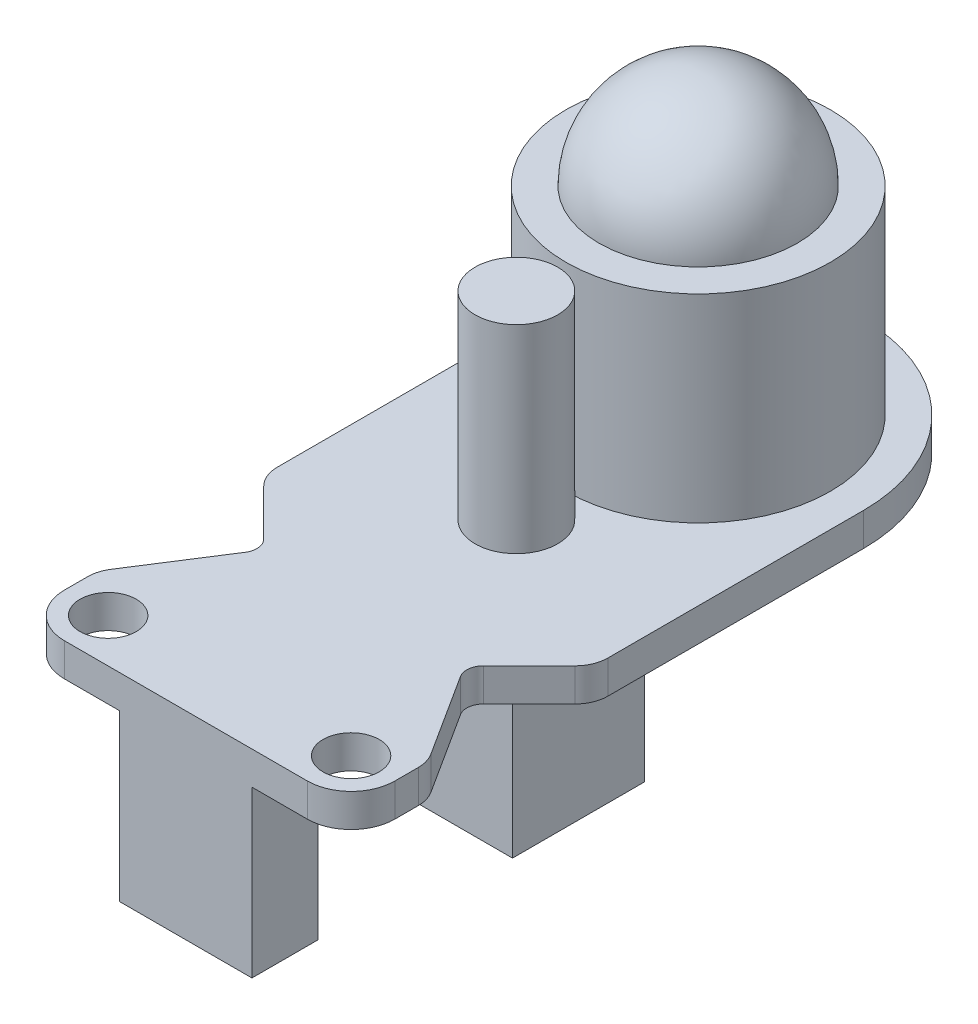
ISO-10303-21;
HEADER;
FILE_DESCRIPTION(('STEP AP214'),'2;1');
FILE_NAME('part.step','',(''),(''),'','','');
FILE_SCHEMA(('AUTOMOTIVE_DESIGN { 1 0 10303 214 1 1 1 1 }'));
ENDSEC;
DATA;
#1=APPLICATION_CONTEXT('core data for automotive mechanical design processes');
#2=APPLICATION_PROTOCOL_DEFINITION('international standard','automotive_design',2000,#1);
#3=PRODUCT_CONTEXT('',#1,'mechanical');
#4=PRODUCT('Part','Part','',(#3));
#5=PRODUCT_RELATED_PRODUCT_CATEGORY('part','',(#4));
#6=PRODUCT_DEFINITION_FORMATION('','',#4);
#7=PRODUCT_DEFINITION_CONTEXT('part definition',#1,'design');
#8=PRODUCT_DEFINITION('design','',#6,#7);
#9=PRODUCT_DEFINITION_SHAPE('','',#8);
#10=(LENGTH_UNIT() NAMED_UNIT(*) SI_UNIT(.MILLI.,.METRE.));
#11=(NAMED_UNIT(*) PLANE_ANGLE_UNIT() SI_UNIT($,.RADIAN.));
#12=(NAMED_UNIT(*) SI_UNIT($,.STERADIAN.) SOLID_ANGLE_UNIT());
#13=UNCERTAINTY_MEASURE_WITH_UNIT(LENGTH_MEASURE(1.E-05),#10,'distance_accuracy_value','');
#14=(GEOMETRIC_REPRESENTATION_CONTEXT(3) GLOBAL_UNCERTAINTY_ASSIGNED_CONTEXT((#13)) GLOBAL_UNIT_ASSIGNED_CONTEXT((#10,
#11,#12)) REPRESENTATION_CONTEXT('',''));
#15=CARTESIAN_POINT('',(0.,0.,0.));
#16=DIRECTION('',(0.,0.,1.));
#17=DIRECTION('',(1.,0.,0.));
#18=AXIS2_PLACEMENT_3D('',#15,#16,#17);
#19=CARTESIAN_POINT('',(-7.35,0.,0.));
#20=DIRECTION('',(0.,-1.,0.));
#21=DIRECTION('',(0.,0.,-1.));
#22=AXIS2_PLACEMENT_3D('',#19,#20,#21);
#23=PLANE('',#22);
#24=CARTESIAN_POINT('',(-7.35,0.,0.));
#25=DIRECTION('',(0.,1.,0.));
#26=DIRECTION('',(0.,0.,-1.));
#27=AXIS2_PLACEMENT_3D('',#24,#25,#26);
#28=CIRCLE('',#27,1.7);
#29=CARTESIAN_POINT('',(-7.35,0.,-1.7));
#30=VERTEX_POINT('',#29);
#31=EDGE_CURVE('E275',#30,#30,#28,.T.);
#32=ORIENTED_EDGE('',*,*,#31,.T.);
#33=EDGE_LOOP('',(#32));
#34=FACE_BOUND('',#33,.T.);
#35=CARTESIAN_POINT('',(7.35,0.,0.));
#36=DIRECTION('',(0.,1.,0.));
#37=DIRECTION('',(0.,0.,1.));
#38=AXIS2_PLACEMENT_3D('',#35,#36,#37);
#39=CIRCLE('',#38,1.7);
#40=CARTESIAN_POINT('',(7.35,0.,1.7));
#41=VERTEX_POINT('',#40);
#42=EDGE_CURVE('E271',#41,#41,#39,.T.);
#43=ORIENTED_EDGE('',*,*,#42,.T.);
#44=EDGE_LOOP('',(#43));
#45=FACE_BOUND('',#44,.T.);
#46=DIRECTION('',(1.,0.,0.));
#47=VECTOR('',#46,1.);
#48=CARTESIAN_POINT('',(3.60168525792392,0.,-21.5134690772025));
#49=LINE('',#48,#47);
#50=CARTESIAN_POINT('',(-4.39831474207608,0.,-21.5134690772025));
#51=VERTEX_POINT('',#50);
#52=CARTESIAN_POINT('',(3.60168525792392,0.,-21.5134690772025));
#53=VERTEX_POINT('',#52);
#54=EDGE_CURVE('E237',#51,#53,#49,.T.);
#55=ORIENTED_EDGE('',*,*,#54,.F.);
#56=DIRECTION('',(0.,0.,-1.));
#57=VECTOR('',#56,1.);
#58=CARTESIAN_POINT('',(-4.39831474207608,0.,-21.5134690772025));
#59=LINE('',#58,#57);
#60=CARTESIAN_POINT('',(-4.39831474207608,0.,-13.5134690772025));
#61=VERTEX_POINT('',#60);
#62=EDGE_CURVE('E234',#61,#51,#59,.T.);
#63=ORIENTED_EDGE('',*,*,#62,.F.);
#64=DIRECTION('',(-1.,0.,0.));
#65=VECTOR('',#64,1.);
#66=CARTESIAN_POINT('',(3.60168525792392,0.,-13.5134690772025));
#67=LINE('',#66,#65);
#68=CARTESIAN_POINT('',(3.60168525792392,0.,-13.5134690772025));
#69=VERTEX_POINT('',#68);
#70=EDGE_CURVE('E246',#69,#61,#67,.T.);
#71=ORIENTED_EDGE('',*,*,#70,.F.);
#72=DIRECTION('',(0.,0.,1.));
#73=VECTOR('',#72,1.);
#74=CARTESIAN_POINT('',(3.60168525792392,0.,-21.5134690772025));
#75=LINE('',#74,#73);
#76=EDGE_CURVE('E254',#53,#69,#75,.T.);
#77=ORIENTED_EDGE('',*,*,#76,.F.);
#78=EDGE_LOOP('',(#55,#63,#71,#77));
#79=FACE_BOUND('',#78,.T.);
#80=DIRECTION('',(1.,0.,0.));
#81=VECTOR('',#80,1.);
#82=CARTESIAN_POINT('',(4.,0.,-1.35));
#83=LINE('',#82,#81);
#84=CARTESIAN_POINT('',(-4.,0.,-1.35));
#85=VERTEX_POINT('',#84);
#86=CARTESIAN_POINT('',(4.,0.,-1.35));
#87=VERTEX_POINT('',#86);
#88=EDGE_CURVE('E452',#85,#87,#83,.T.);
#89=ORIENTED_EDGE('',*,*,#88,.F.);
#90=DIRECTION('',(0.,0.,-1.));
#91=VECTOR('',#90,1.);
#92=CARTESIAN_POINT('',(-4.,0.,-1.35));
#93=LINE('',#92,#91);
#94=CARTESIAN_POINT('',(-4.,0.,2.65));
#95=VERTEX_POINT('',#94);
#96=EDGE_CURVE('E232',#95,#85,#93,.T.);
#97=ORIENTED_EDGE('',*,*,#96,.F.);
#98=DIRECTION('',(1.,0.,0.));
#99=VECTOR('',#98,1.);
#100=CARTESIAN_POINT('',(7.35,0.,2.65));
#101=LINE('',#100,#99);
#102=CARTESIAN_POINT('',(-7.35,0.,2.65));
#103=VERTEX_POINT('',#102);
#104=EDGE_CURVE('E322',#103,#95,#101,.T.);
#105=ORIENTED_EDGE('',*,*,#104,.F.);
#106=CARTESIAN_POINT('',(-7.35,0.,0.));
#107=DIRECTION('',(0.,1.,0.));
#108=DIRECTION('',(0.,0.,-1.));
#109=AXIS2_PLACEMENT_3D('',#106,#107,#108);
#110=CIRCLE('',#109,2.65);
#111=CARTESIAN_POINT('',(-10.,0.,0.));
#112=VERTEX_POINT('',#111);
#113=EDGE_CURVE('E281',#112,#103,#110,.T.);
#114=ORIENTED_EDGE('',*,*,#113,.F.);
#115=DIRECTION('',(0.,0.,1.));
#116=VECTOR('',#115,1.);
#117=CARTESIAN_POINT('',(-10.,0.,-2.));
#118=LINE('',#117,#116);
#119=CARTESIAN_POINT('',(-10.,0.,-1.41518014706803));
#120=VERTEX_POINT('',#119);
#121=EDGE_CURVE('E288',#120,#112,#118,.T.);
#122=ORIENTED_EDGE('',*,*,#121,.F.);
#123=CARTESIAN_POINT('',(-8.,0.,-1.41518014706802));
#124=DIRECTION('',(0.,-1.,0.));
#125=DIRECTION('',(0.,0.,-1.));
#126=AXIS2_PLACEMENT_3D('',#123,#124,#125);
#127=CIRCLE('',#126,2.);
#128=CARTESIAN_POINT('',(-9.68492571431289,0.,-2.49268900422288));
#129=VERTEX_POINT('',#128);
#130=EDGE_CURVE('E390',#120,#129,#127,.T.);
#131=ORIENTED_EDGE('',*,*,#130,.T.);
#132=DIRECTION('',(-0.538754428577431,0.,0.842462857156448));
#133=VECTOR('',#132,1.);
#134=CARTESIAN_POINT('',(-6.50753714284355,0.,-7.46124557142257));
#135=LINE('',#134,#133);
#136=CARTESIAN_POINT('',(-6.50753714284355,0.,-7.46124557142257));
#137=VERTEX_POINT('',#136);
#138=EDGE_CURVE('E348',#137,#129,#135,.T.);
#139=ORIENTED_EDGE('',*,*,#138,.F.);
#140=CARTESIAN_POINT('',(-7.35,0.,-8.));
#141=DIRECTION('',(0.,-1.,0.));
#142=DIRECTION('',(0.,0.,-1.));
#143=AXIS2_PLACEMENT_3D('',#140,#141,#142);
#144=CIRCLE('',#143,1.);
#145=CARTESIAN_POINT('',(-6.64289321881345,0.,-8.70710678118655));
#146=VERTEX_POINT('',#145);
#147=EDGE_CURVE('E346',#146,#137,#144,.T.);
#148=ORIENTED_EDGE('',*,*,#147,.F.);
#149=DIRECTION('',(0.707106781186549,0.,0.707106781186546));
#150=VECTOR('',#149,1.);
#151=CARTESIAN_POINT('',(-9.99999999999999,0.,-12.0642135623731));
#152=LINE('',#151,#150);
#153=CARTESIAN_POINT('',(-9.41421356237309,0.,-11.4784271247462));
#154=VERTEX_POINT('',#153);
#155=EDGE_CURVE('E344',#154,#146,#152,.T.);
#156=ORIENTED_EDGE('',*,*,#155,.F.);
#157=CARTESIAN_POINT('',(-7.99999999999999,0.,-12.8926406871193));
#158=DIRECTION('',(0.,-1.,0.));
#159=DIRECTION('',(0.,0.,-1.));
#160=AXIS2_PLACEMENT_3D('',#157,#158,#159);
#161=CIRCLE('',#160,2.);
#162=CARTESIAN_POINT('',(-9.99999999999999,0.,-12.8926406871193));
#163=VERTEX_POINT('',#162);
#164=EDGE_CURVE('E388',#154,#163,#161,.T.);
#165=ORIENTED_EDGE('',*,*,#164,.T.);
#166=DIRECTION('',(0.,0.,1.));
#167=VECTOR('',#166,1.);
#168=CARTESIAN_POINT('',(-10.,0.,-28.35));
#169=LINE('',#168,#167);
#170=CARTESIAN_POINT('',(-10.,0.,-28.35));
#171=VERTEX_POINT('',#170);
#172=EDGE_CURVE('E341',#171,#163,#169,.T.);
#173=ORIENTED_EDGE('',*,*,#172,.F.);
#174=CARTESIAN_POINT('',(0.,0.,-28.35));
#175=DIRECTION('',(0.,1.,0.));
#176=DIRECTION('',(0.,0.,1.));
#177=AXIS2_PLACEMENT_3D('',#174,#175,#176);
#178=CIRCLE('',#177,10.);
#179=CARTESIAN_POINT('',(10.,0.,-28.35));
#180=VERTEX_POINT('',#179);
#181=EDGE_CURVE('E339',#180,#171,#178,.T.);
#182=ORIENTED_EDGE('',*,*,#181,.F.);
#183=DIRECTION('',(0.,0.,-1.));
#184=VECTOR('',#183,1.);
#185=CARTESIAN_POINT('',(10.,0.,-28.35));
#186=LINE('',#185,#184);
#187=CARTESIAN_POINT('',(9.99999999999999,0.,-12.8926406871193));
#188=VERTEX_POINT('',#187);
#189=EDGE_CURVE('E337',#188,#180,#186,.T.);
#190=ORIENTED_EDGE('',*,*,#189,.F.);
#191=CARTESIAN_POINT('',(7.99999999999999,0.,-12.8926406871193));
#192=DIRECTION('',(0.,-1.,0.));
#193=DIRECTION('',(0.,0.,-1.));
#194=AXIS2_PLACEMENT_3D('',#191,#192,#193);
#195=CIRCLE('',#194,2.);
#196=CARTESIAN_POINT('',(9.41421356237309,0.,-11.4784271247462));
#197=VERTEX_POINT('',#196);
#198=EDGE_CURVE('E384',#188,#197,#195,.T.);
#199=ORIENTED_EDGE('',*,*,#198,.T.);
#200=DIRECTION('',(0.707106781186548,0.,-0.707106781186547));
#201=VECTOR('',#200,1.);
#202=CARTESIAN_POINT('',(9.99999999999999,0.,-12.0642135623731));
#203=LINE('',#202,#201);
#204=CARTESIAN_POINT('',(6.64289321881345,0.,-8.70710678118655));
#205=VERTEX_POINT('',#204);
#206=EDGE_CURVE('E334',#205,#197,#203,.T.);
#207=ORIENTED_EDGE('',*,*,#206,.F.);
#208=CARTESIAN_POINT('',(7.35,0.,-8.));
#209=DIRECTION('',(0.,-1.,0.));
#210=DIRECTION('',(0.,0.,1.));
#211=AXIS2_PLACEMENT_3D('',#208,#209,#210);
#212=CIRCLE('',#211,0.999999999999999);
#213=CARTESIAN_POINT('',(6.50753714284355,0.,-7.46124557142257));
#214=VERTEX_POINT('',#213);
#215=EDGE_CURVE('E332',#214,#205,#212,.T.);
#216=ORIENTED_EDGE('',*,*,#215,.F.);
#217=DIRECTION('',(-0.538754428577431,0.,-0.842462857156448));
#218=VECTOR('',#217,1.);
#219=CARTESIAN_POINT('',(6.50753714284355,0.,-7.46124557142257));
#220=LINE('',#219,#218);
#221=CARTESIAN_POINT('',(9.6849257143129,0.,-2.49268900422288));
#222=VERTEX_POINT('',#221);
#223=EDGE_CURVE('E330',#222,#214,#220,.T.);
#224=ORIENTED_EDGE('',*,*,#223,.F.);
#225=CARTESIAN_POINT('',(8.,0.,-1.41518014706802));
#226=DIRECTION('',(0.,-1.,0.));
#227=DIRECTION('',(0.,0.,-1.));
#228=AXIS2_PLACEMENT_3D('',#225,#226,#227);
#229=CIRCLE('',#228,2.);
#230=CARTESIAN_POINT('',(10.,0.,-1.41518014706803));
#231=VERTEX_POINT('',#230);
#232=EDGE_CURVE('E386',#222,#231,#229,.T.);
#233=ORIENTED_EDGE('',*,*,#232,.T.);
#234=DIRECTION('',(0.,0.,-1.));
#235=VECTOR('',#234,1.);
#236=CARTESIAN_POINT('',(10.,0.,-2.));
#237=LINE('',#236,#235);
#238=CARTESIAN_POINT('',(10.,0.,0.));
#239=VERTEX_POINT('',#238);
#240=EDGE_CURVE('E327',#239,#231,#237,.T.);
#241=ORIENTED_EDGE('',*,*,#240,.F.);
#242=CARTESIAN_POINT('',(7.35,0.,0.));
#243=DIRECTION('',(0.,1.,0.));
#244=DIRECTION('',(0.,0.,1.));
#245=AXIS2_PLACEMENT_3D('',#242,#243,#244);
#246=CIRCLE('',#245,2.65);
#247=CARTESIAN_POINT('',(7.35,0.,2.65));
#248=VERTEX_POINT('',#247);
#249=EDGE_CURVE('E325',#248,#239,#246,.T.);
#250=ORIENTED_EDGE('',*,*,#249,.F.);
#251=CARTESIAN_POINT('',(4.,0.,2.65));
#252=VERTEX_POINT('',#251);
#253=EDGE_CURVE('E321',#252,#248,#101,.T.);
#254=ORIENTED_EDGE('',*,*,#253,.F.);
#255=DIRECTION('',(0.,0.,1.));
#256=VECTOR('',#255,1.);
#257=CARTESIAN_POINT('',(4.,0.,-1.35));
#258=LINE('',#257,#256);
#259=EDGE_CURVE('E228',#87,#252,#258,.T.);
#260=ORIENTED_EDGE('',*,*,#259,.F.);
#261=EDGE_LOOP('',(#89,#97,#105,#114,#122,#131,#139,#148,#156,#165,#173,#182,#190,#199,#207,
#216,#224,#233,#241,#250,#254,#260));
#262=FACE_BOUND('',#261,.T.);
#263=ADVANCED_FACE('F35',(#34,#45,#79,#262),#23,.T.);
#264=CARTESIAN_POINT('',(-7.35,2.,0.));
#265=DIRECTION('',(0.,-1.,0.));
#266=DIRECTION('',(0.,0.,-1.));
#267=AXIS2_PLACEMENT_3D('',#264,#265,#266);
#268=PLANE('',#267);
#269=CARTESIAN_POINT('',(0.,2.,-17.35));
#270=DIRECTION('',(0.,-1.,0.));
#271=DIRECTION('',(0.,0.,-1.));
#272=AXIS2_PLACEMENT_3D('',#269,#270,#271);
#273=CIRCLE('',#272,2.5);
#274=CARTESIAN_POINT('',(0.,2.,-19.85));
#275=VERTEX_POINT('',#274);
#276=EDGE_CURVE('E11',#275,#275,#273,.F.);
#277=ORIENTED_EDGE('',*,*,#276,.F.);
#278=EDGE_LOOP('',(#277));
#279=FACE_BOUND('',#278,.T.);
#280=CARTESIAN_POINT('',(0.,2.,-28.35));
#281=DIRECTION('',(0.,-1.,0.));
#282=DIRECTION('',(0.,0.,-1.));
#283=AXIS2_PLACEMENT_3D('',#280,#281,#282);
#284=CIRCLE('',#283,8.);
#285=CARTESIAN_POINT('',(0.,2.,-36.35));
#286=VERTEX_POINT('',#285);
#287=EDGE_CURVE('E44',#286,#286,#284,.F.);
#288=ORIENTED_EDGE('',*,*,#287,.F.);
#289=EDGE_LOOP('',(#288));
#290=FACE_BOUND('',#289,.T.);
#291=DIRECTION('',(-0.538754428577431,0.,0.842462857156448));
#292=VECTOR('',#291,1.);
#293=CARTESIAN_POINT('',(-6.50753714284355,2.,-7.46124557142257));
#294=LINE('',#293,#292);
#295=CARTESIAN_POINT('',(-6.50753714284355,2.,-7.46124557142257));
#296=VERTEX_POINT('',#295);
#297=CARTESIAN_POINT('',(-9.68492571431289,2.,-2.49268900422288));
#298=VERTEX_POINT('',#297);
#299=EDGE_CURVE('E313',#296,#298,#294,.T.);
#300=ORIENTED_EDGE('',*,*,#299,.T.);
#301=CARTESIAN_POINT('',(-8.,2.,-1.41518014706802));
#302=DIRECTION('',(0.,-1.,0.));
#303=DIRECTION('',(0.,0.,-1.));
#304=AXIS2_PLACEMENT_3D('',#301,#302,#303);
#305=CIRCLE('',#304,2.);
#306=CARTESIAN_POINT('',(-10.,2.,-1.41518014706803));
#307=VERTEX_POINT('',#306);
#308=EDGE_CURVE('E400',#298,#307,#305,.F.);
#309=ORIENTED_EDGE('',*,*,#308,.T.);
#310=DIRECTION('',(0.,0.,1.));
#311=VECTOR('',#310,1.);
#312=CARTESIAN_POINT('',(-10.,2.,-2.));
#313=LINE('',#312,#311);
#314=CARTESIAN_POINT('',(-10.,2.,0.));
#315=VERTEX_POINT('',#314);
#316=EDGE_CURVE('E316',#307,#315,#313,.T.);
#317=ORIENTED_EDGE('',*,*,#316,.T.);
#318=CARTESIAN_POINT('',(-7.35,2.,0.));
#319=DIRECTION('',(0.,1.,0.));
#320=DIRECTION('',(0.,0.,-1.));
#321=AXIS2_PLACEMENT_3D('',#318,#319,#320);
#322=CIRCLE('',#321,2.65);
#323=CARTESIAN_POINT('',(-7.35,2.,2.65));
#324=VERTEX_POINT('',#323);
#325=EDGE_CURVE('E284',#315,#324,#322,.T.);
#326=ORIENTED_EDGE('',*,*,#325,.T.);
#327=DIRECTION('',(1.,0.,0.));
#328=VECTOR('',#327,1.);
#329=CARTESIAN_POINT('',(7.35,2.,2.65));
#330=LINE('',#329,#328);
#331=CARTESIAN_POINT('',(7.35,2.,2.65));
#332=VERTEX_POINT('',#331);
#333=EDGE_CURVE('E287',#324,#332,#330,.T.);
#334=ORIENTED_EDGE('',*,*,#333,.T.);
#335=CARTESIAN_POINT('',(7.35,2.,0.));
#336=DIRECTION('',(0.,1.,0.));
#337=DIRECTION('',(0.,0.,1.));
#338=AXIS2_PLACEMENT_3D('',#335,#336,#337);
#339=CIRCLE('',#338,2.65);
#340=CARTESIAN_POINT('',(10.,2.,0.));
#341=VERTEX_POINT('',#340);
#342=EDGE_CURVE('E290',#332,#341,#339,.T.);
#343=ORIENTED_EDGE('',*,*,#342,.T.);
#344=DIRECTION('',(0.,0.,-1.));
#345=VECTOR('',#344,1.);
#346=CARTESIAN_POINT('',(10.,2.,-2.));
#347=LINE('',#346,#345);
#348=CARTESIAN_POINT('',(10.,2.,-1.41518014706803));
#349=VERTEX_POINT('',#348);
#350=EDGE_CURVE('E292',#341,#349,#347,.T.);
#351=ORIENTED_EDGE('',*,*,#350,.T.);
#352=CARTESIAN_POINT('',(8.,2.,-1.41518014706802));
#353=DIRECTION('',(0.,-1.,0.));
#354=DIRECTION('',(0.,0.,-1.));
#355=AXIS2_PLACEMENT_3D('',#352,#353,#354);
#356=CIRCLE('',#355,2.);
#357=CARTESIAN_POINT('',(9.6849257143129,2.,-2.49268900422288));
#358=VERTEX_POINT('',#357);
#359=EDGE_CURVE('E396',#349,#358,#356,.F.);
#360=ORIENTED_EDGE('',*,*,#359,.T.);
#361=DIRECTION('',(-0.538754428577431,0.,-0.842462857156448));
#362=VECTOR('',#361,1.);
#363=CARTESIAN_POINT('',(6.50753714284355,2.,-7.46124557142257));
#364=LINE('',#363,#362);
#365=CARTESIAN_POINT('',(6.50753714284355,2.,-7.46124557142257));
#366=VERTEX_POINT('',#365);
#367=EDGE_CURVE('E295',#358,#366,#364,.T.);
#368=ORIENTED_EDGE('',*,*,#367,.T.);
#369=CARTESIAN_POINT('',(7.35,2.,-8.));
#370=DIRECTION('',(0.,-1.,0.));
#371=DIRECTION('',(0.,0.,1.));
#372=AXIS2_PLACEMENT_3D('',#369,#370,#371);
#373=CIRCLE('',#372,0.999999999999999);
#374=CARTESIAN_POINT('',(6.64289321881345,2.,-8.70710678118655));
#375=VERTEX_POINT('',#374);
#376=EDGE_CURVE('E297',#366,#375,#373,.T.);
#377=ORIENTED_EDGE('',*,*,#376,.T.);
#378=DIRECTION('',(0.707106781186548,0.,-0.707106781186547));
#379=VECTOR('',#378,1.);
#380=CARTESIAN_POINT('',(9.99999999999999,2.,-12.0642135623731));
#381=LINE('',#380,#379);
#382=CARTESIAN_POINT('',(9.41421356237309,2.,-11.4784271247462));
#383=VERTEX_POINT('',#382);
#384=EDGE_CURVE('E299',#375,#383,#381,.T.);
#385=ORIENTED_EDGE('',*,*,#384,.T.);
#386=CARTESIAN_POINT('',(7.99999999999999,2.,-12.8926406871193));
#387=DIRECTION('',(0.,-1.,0.));
#388=DIRECTION('',(0.,0.,-1.));
#389=AXIS2_PLACEMENT_3D('',#386,#387,#388);
#390=CIRCLE('',#389,2.);
#391=CARTESIAN_POINT('',(9.99999999999999,2.,-12.8926406871193));
#392=VERTEX_POINT('',#391);
#393=EDGE_CURVE('E394',#383,#392,#390,.F.);
#394=ORIENTED_EDGE('',*,*,#393,.T.);
#395=DIRECTION('',(0.,0.,-1.));
#396=VECTOR('',#395,1.);
#397=CARTESIAN_POINT('',(10.,2.,-28.35));
#398=LINE('',#397,#396);
#399=CARTESIAN_POINT('',(10.,2.,-28.35));
#400=VERTEX_POINT('',#399);
#401=EDGE_CURVE('E302',#392,#400,#398,.T.);
#402=ORIENTED_EDGE('',*,*,#401,.T.);
#403=CARTESIAN_POINT('',(0.,2.,-28.35));
#404=DIRECTION('',(0.,1.,0.));
#405=DIRECTION('',(0.,0.,1.));
#406=AXIS2_PLACEMENT_3D('',#403,#404,#405);
#407=CIRCLE('',#406,10.);
#408=CARTESIAN_POINT('',(-10.,2.,-28.35));
#409=VERTEX_POINT('',#408);
#410=EDGE_CURVE('E304',#400,#409,#407,.T.);
#411=ORIENTED_EDGE('',*,*,#410,.T.);
#412=DIRECTION('',(0.,0.,1.));
#413=VECTOR('',#412,1.);
#414=CARTESIAN_POINT('',(-10.,2.,-28.35));
#415=LINE('',#414,#413);
#416=CARTESIAN_POINT('',(-9.99999999999999,2.,-12.8926406871193));
#417=VERTEX_POINT('',#416);
#418=EDGE_CURVE('E306',#409,#417,#415,.T.);
#419=ORIENTED_EDGE('',*,*,#418,.T.);
#420=CARTESIAN_POINT('',(-7.99999999999999,2.,-12.8926406871193));
#421=DIRECTION('',(0.,-1.,0.));
#422=DIRECTION('',(0.,0.,-1.));
#423=AXIS2_PLACEMENT_3D('',#420,#421,#422);
#424=CIRCLE('',#423,2.);
#425=CARTESIAN_POINT('',(-9.41421356237309,2.,-11.4784271247462));
#426=VERTEX_POINT('',#425);
#427=EDGE_CURVE('E398',#417,#426,#424,.F.);
#428=ORIENTED_EDGE('',*,*,#427,.T.);
#429=DIRECTION('',(0.707106781186549,0.,0.707106781186546));
#430=VECTOR('',#429,1.);
#431=CARTESIAN_POINT('',(-9.99999999999999,2.,-12.0642135623731));
#432=LINE('',#431,#430);
#433=CARTESIAN_POINT('',(-6.64289321881345,2.,-8.70710678118655));
#434=VERTEX_POINT('',#433);
#435=EDGE_CURVE('E309',#426,#434,#432,.T.);
#436=ORIENTED_EDGE('',*,*,#435,.T.);
#437=CARTESIAN_POINT('',(-7.35,2.,-8.));
#438=DIRECTION('',(0.,-1.,0.));
#439=DIRECTION('',(0.,0.,-1.));
#440=AXIS2_PLACEMENT_3D('',#437,#438,#439);
#441=CIRCLE('',#440,1.);
#442=EDGE_CURVE('E311',#434,#296,#441,.T.);
#443=ORIENTED_EDGE('',*,*,#442,.T.);
#444=EDGE_LOOP('',(#300,#309,#317,#326,#334,#343,#351,#360,#368,#377,#385,#394,#402,#411,#419,
#428,#436,#443));
#445=FACE_BOUND('',#444,.T.);
#446=CARTESIAN_POINT('',(-7.35,2.,0.));
#447=DIRECTION('',(0.,1.,0.));
#448=DIRECTION('',(0.,0.,-1.));
#449=AXIS2_PLACEMENT_3D('',#446,#447,#448);
#450=CIRCLE('',#449,1.7);
#451=CARTESIAN_POINT('',(-7.35,2.,-1.7));
#452=VERTEX_POINT('',#451);
#453=EDGE_CURVE('E278',#452,#452,#450,.T.);
#454=ORIENTED_EDGE('',*,*,#453,.F.);
#455=EDGE_LOOP('',(#454));
#456=FACE_BOUND('',#455,.T.);
#457=CARTESIAN_POINT('',(7.35,2.,0.));
#458=DIRECTION('',(0.,1.,0.));
#459=DIRECTION('',(0.,0.,1.));
#460=AXIS2_PLACEMENT_3D('',#457,#458,#459);
#461=CIRCLE('',#460,1.7);
#462=CARTESIAN_POINT('',(7.35,2.,1.7));
#463=VERTEX_POINT('',#462);
#464=EDGE_CURVE('E272',#463,#463,#461,.T.);
#465=ORIENTED_EDGE('',*,*,#464,.F.);
#466=EDGE_LOOP('',(#465));
#467=FACE_BOUND('',#466,.T.);
#468=ADVANCED_FACE('F422',(#279,#290,#445,#456,#467),#268,.F.);
#469=CARTESIAN_POINT('',(-7.35,2.,0.));
#470=DIRECTION('',(0.,-1.,0.));
#471=DIRECTION('',(0.,0.,-1.));
#472=AXIS2_PLACEMENT_3D('',#469,#470,#471);
#473=CYLINDRICAL_SURFACE('',#472,2.65);
#474=ORIENTED_EDGE('',*,*,#113,.T.);
#475=DIRECTION('',(0.,-1.,0.));
#476=VECTOR('',#475,1.);
#477=CARTESIAN_POINT('',(-7.35,2.,2.65));
#478=LINE('',#477,#476);
#479=EDGE_CURVE('E378',#324,#103,#478,.T.);
#480=ORIENTED_EDGE('',*,*,#479,.F.);
#481=ORIENTED_EDGE('',*,*,#325,.F.);
#482=DIRECTION('',(0.,-1.,0.));
#483=VECTOR('',#482,1.);
#484=CARTESIAN_POINT('',(-10.,2.,0.));
#485=LINE('',#484,#483);
#486=EDGE_CURVE('E318',#315,#112,#485,.T.);
#487=ORIENTED_EDGE('',*,*,#486,.T.);
#488=EDGE_LOOP('',(#474,#480,#481,#487));
#489=FACE_BOUND('',#488,.T.);
#490=ADVANCED_FACE('F425',(#489),#473,.T.);
#491=CARTESIAN_POINT('',(7.35,2.,2.65));
#492=DIRECTION('',(0.,0.,-1.));
#493=DIRECTION('',(-1.,0.,0.));
#494=AXIS2_PLACEMENT_3D('',#491,#492,#493);
#495=PLANE('',#494);
#496=ORIENTED_EDGE('',*,*,#104,.T.);
#497=DIRECTION('',(0.,1.,0.));
#498=VECTOR('',#497,1.);
#499=CARTESIAN_POINT('',(-4.,-10.,2.65));
#500=LINE('',#499,#498);
#501=CARTESIAN_POINT('',(-4.,-10.,2.65));
#502=VERTEX_POINT('',#501);
#503=EDGE_CURVE('E459',#502,#95,#500,.T.);
#504=ORIENTED_EDGE('',*,*,#503,.F.);
#505=DIRECTION('',(-1.,0.,0.));
#506=VECTOR('',#505,1.);
#507=CARTESIAN_POINT('',(4.,-10.,2.65));
#508=LINE('',#507,#506);
#509=CARTESIAN_POINT('',(4.,-10.,2.65));
#510=VERTEX_POINT('',#509);
#511=EDGE_CURVE('E225',#510,#502,#508,.T.);
#512=ORIENTED_EDGE('',*,*,#511,.F.);
#513=DIRECTION('',(0.,1.,0.));
#514=VECTOR('',#513,1.);
#515=CARTESIAN_POINT('',(4.,-10.,2.65));
#516=LINE('',#515,#514);
#517=EDGE_CURVE('E51',#510,#252,#516,.T.);
#518=ORIENTED_EDGE('',*,*,#517,.T.);
#519=ORIENTED_EDGE('',*,*,#253,.T.);
#520=DIRECTION('',(0.,-1.,0.));
#521=VECTOR('',#520,1.);
#522=CARTESIAN_POINT('',(7.35,2.,2.65));
#523=LINE('',#522,#521);
#524=EDGE_CURVE('E375',#332,#248,#523,.T.);
#525=ORIENTED_EDGE('',*,*,#524,.F.);
#526=ORIENTED_EDGE('',*,*,#333,.F.);
#527=ORIENTED_EDGE('',*,*,#479,.T.);
#528=EDGE_LOOP('',(#496,#504,#512,#518,#519,#525,#526,#527));
#529=FACE_BOUND('',#528,.T.);
#530=ADVANCED_FACE('F463',(#529),#495,.F.);
#531=CARTESIAN_POINT('',(7.35,2.,0.));
#532=DIRECTION('',(0.,-1.,0.));
#533=DIRECTION('',(0.,0.,-1.));
#534=AXIS2_PLACEMENT_3D('',#531,#532,#533);
#535=CYLINDRICAL_SURFACE('',#534,2.65);
#536=ORIENTED_EDGE('',*,*,#249,.T.);
#537=DIRECTION('',(0.,-1.,0.));
#538=VECTOR('',#537,1.);
#539=CARTESIAN_POINT('',(10.,2.,0.));
#540=LINE('',#539,#538);
#541=EDGE_CURVE('E372',#341,#239,#540,.T.);
#542=ORIENTED_EDGE('',*,*,#541,.F.);
#543=ORIENTED_EDGE('',*,*,#342,.F.);
#544=ORIENTED_EDGE('',*,*,#524,.T.);
#545=EDGE_LOOP('',(#536,#542,#543,#544));
#546=FACE_BOUND('',#545,.T.);
#547=ADVANCED_FACE('F539',(#546),#535,.T.);
#548=CARTESIAN_POINT('',(10.,2.,-2.));
#549=DIRECTION('',(-1.,0.,0.));
#550=DIRECTION('',(0.,0.,1.));
#551=AXIS2_PLACEMENT_3D('',#548,#549,#550);
#552=PLANE('',#551);
#553=ORIENTED_EDGE('',*,*,#240,.T.);
#554=DIRECTION('',(0.,-1.,0.));
#555=VECTOR('',#554,1.);
#556=CARTESIAN_POINT('',(10.,2.,-1.41518014706803));
#557=LINE('',#556,#555);
#558=EDGE_CURVE('E410',#231,#349,#557,.F.);
#559=ORIENTED_EDGE('',*,*,#558,.T.);
#560=ORIENTED_EDGE('',*,*,#350,.F.);
#561=ORIENTED_EDGE('',*,*,#541,.T.);
#562=EDGE_LOOP('',(#553,#559,#560,#561));
#563=FACE_BOUND('',#562,.T.);
#564=ADVANCED_FACE('F534',(#563),#552,.F.);
#565=CARTESIAN_POINT('',(6.50753714284355,2.,-7.46124557142257));
#566=DIRECTION('',(-0.842462857156448,0.,0.538754428577431));
#567=DIRECTION('',(0.538754428577431,0.,0.842462857156448));
#568=AXIS2_PLACEMENT_3D('',#565,#566,#567);
#569=PLANE('',#568);
#570=ORIENTED_EDGE('',*,*,#367,.F.);
#571=DIRECTION('',(0.,-1.,0.));
#572=VECTOR('',#571,1.);
#573=CARTESIAN_POINT('',(9.68492571431289,2.,-2.49268900422288));
#574=LINE('',#573,#572);
#575=EDGE_CURVE('E407',#358,#222,#574,.T.);
#576=ORIENTED_EDGE('',*,*,#575,.T.);
#577=ORIENTED_EDGE('',*,*,#223,.T.);
#578=DIRECTION('',(0.,-1.,0.));
#579=VECTOR('',#578,1.);
#580=CARTESIAN_POINT('',(6.50753714284355,2.,-7.46124557142257));
#581=LINE('',#580,#579);
#582=EDGE_CURVE('E369',#366,#214,#581,.T.);
#583=ORIENTED_EDGE('',*,*,#582,.F.);
#584=EDGE_LOOP('',(#570,#576,#577,#583));
#585=FACE_BOUND('',#584,.T.);
#586=ADVANCED_FACE('F526',(#585),#569,.F.);
#587=CARTESIAN_POINT('',(7.35,2.,-8.));
#588=DIRECTION('',(0.,-1.,0.));
#589=DIRECTION('',(0.,0.,-1.));
#590=AXIS2_PLACEMENT_3D('',#587,#588,#589);
#591=CYLINDRICAL_SURFACE('',#590,0.999999999999999);
#592=ORIENTED_EDGE('',*,*,#215,.T.);
#593=DIRECTION('',(0.,-1.,0.));
#594=VECTOR('',#593,1.);
#595=CARTESIAN_POINT('',(6.64289321881345,2.,-8.70710678118655));
#596=LINE('',#595,#594);
#597=EDGE_CURVE('E366',#375,#205,#596,.T.);
#598=ORIENTED_EDGE('',*,*,#597,.F.);
#599=ORIENTED_EDGE('',*,*,#376,.F.);
#600=ORIENTED_EDGE('',*,*,#582,.T.);
#601=EDGE_LOOP('',(#592,#598,#599,#600));
#602=FACE_BOUND('',#601,.T.);
#603=ADVANCED_FACE('F521',(#602),#591,.F.);
#604=CARTESIAN_POINT('',(9.99999999999999,2.,-12.0642135623731));
#605=DIRECTION('',(-0.707106781186547,0.,-0.707106781186549));
#606=DIRECTION('',(-0.707106781186549,0.,0.707106781186547));
#607=AXIS2_PLACEMENT_3D('',#604,#605,#606);
#608=PLANE('',#607);
#609=ORIENTED_EDGE('',*,*,#206,.T.);
#610=DIRECTION('',(0.,-1.,0.));
#611=VECTOR('',#610,1.);
#612=CARTESIAN_POINT('',(9.41421356237309,2.,-11.4784271247462));
#613=LINE('',#612,#611);
#614=EDGE_CURVE('E415',#197,#383,#613,.F.);
#615=ORIENTED_EDGE('',*,*,#614,.T.);
#616=ORIENTED_EDGE('',*,*,#384,.F.);
#617=ORIENTED_EDGE('',*,*,#597,.T.);
#618=EDGE_LOOP('',(#609,#615,#616,#617));
#619=FACE_BOUND('',#618,.T.);
#620=ADVANCED_FACE('F515',(#619),#608,.F.);
#621=CARTESIAN_POINT('',(10.,2.,-28.35));
#622=DIRECTION('',(-1.,0.,0.));
#623=DIRECTION('',(0.,0.,1.));
#624=AXIS2_PLACEMENT_3D('',#621,#622,#623);
#625=PLANE('',#624);
#626=ORIENTED_EDGE('',*,*,#401,.F.);
#627=DIRECTION('',(0.,-1.,0.));
#628=VECTOR('',#627,1.);
#629=CARTESIAN_POINT('',(9.99999999999999,2.,-12.8926406871193));
#630=LINE('',#629,#628);
#631=EDGE_CURVE('E412',#392,#188,#630,.T.);
#632=ORIENTED_EDGE('',*,*,#631,.T.);
#633=ORIENTED_EDGE('',*,*,#189,.T.);
#634=DIRECTION('',(0.,-1.,0.));
#635=VECTOR('',#634,1.);
#636=CARTESIAN_POINT('',(10.,2.,-28.35));
#637=LINE('',#636,#635);
#638=EDGE_CURVE('E363',#400,#180,#637,.T.);
#639=ORIENTED_EDGE('',*,*,#638,.F.);
#640=EDGE_LOOP('',(#626,#632,#633,#639));
#641=FACE_BOUND('',#640,.T.);
#642=ADVANCED_FACE('F508',(#641),#625,.F.);
#643=CARTESIAN_POINT('',(0.,2.,-28.35));
#644=DIRECTION('',(0.,-1.,0.));
#645=DIRECTION('',(0.,0.,-1.));
#646=AXIS2_PLACEMENT_3D('',#643,#644,#645);
#647=CYLINDRICAL_SURFACE('',#646,10.);
#648=ORIENTED_EDGE('',*,*,#181,.T.);
#649=DIRECTION('',(0.,-1.,0.));
#650=VECTOR('',#649,1.);
#651=CARTESIAN_POINT('',(-10.,2.,-28.35));
#652=LINE('',#651,#650);
#653=EDGE_CURVE('E360',#409,#171,#652,.T.);
#654=ORIENTED_EDGE('',*,*,#653,.F.);
#655=ORIENTED_EDGE('',*,*,#410,.F.);
#656=ORIENTED_EDGE('',*,*,#638,.T.);
#657=EDGE_LOOP('',(#648,#654,#655,#656));
#658=FACE_BOUND('',#657,.T.);
#659=ADVANCED_FACE('F503',(#658),#647,.T.);
#660=CARTESIAN_POINT('',(-10.,2.,-28.35));
#661=DIRECTION('',(1.,0.,0.));
#662=DIRECTION('',(0.,0.,-1.));
#663=AXIS2_PLACEMENT_3D('',#660,#661,#662);
#664=PLANE('',#663);
#665=ORIENTED_EDGE('',*,*,#172,.T.);
#666=DIRECTION('',(0.,-1.,0.));
#667=VECTOR('',#666,1.);
#668=CARTESIAN_POINT('',(-9.99999999999999,2.,-12.8926406871193));
#669=LINE('',#668,#667);
#670=EDGE_CURVE('E405',#163,#417,#669,.F.);
#671=ORIENTED_EDGE('',*,*,#670,.T.);
#672=ORIENTED_EDGE('',*,*,#418,.F.);
#673=ORIENTED_EDGE('',*,*,#653,.T.);
#674=EDGE_LOOP('',(#665,#671,#672,#673));
#675=FACE_BOUND('',#674,.T.);
#676=ADVANCED_FACE('F497',(#675),#664,.F.);
#677=CARTESIAN_POINT('',(-9.99999999999999,2.,-12.0642135623731));
#678=DIRECTION('',(0.707106781186546,0.,-0.707106781186549));
#679=DIRECTION('',(-0.707106781186549,0.,-0.707106781186546));
#680=AXIS2_PLACEMENT_3D('',#677,#678,#679);
#681=PLANE('',#680);
#682=ORIENTED_EDGE('',*,*,#435,.F.);
#683=DIRECTION('',(0.,-1.,0.));
#684=VECTOR('',#683,1.);
#685=CARTESIAN_POINT('',(-9.41421356237309,2.,-11.4784271247462));
#686=LINE('',#685,#684);
#687=EDGE_CURVE('E402',#426,#154,#686,.T.);
#688=ORIENTED_EDGE('',*,*,#687,.T.);
#689=ORIENTED_EDGE('',*,*,#155,.T.);
#690=DIRECTION('',(0.,-1.,0.));
#691=VECTOR('',#690,1.);
#692=CARTESIAN_POINT('',(-6.64289321881345,2.,-8.70710678118655));
#693=LINE('',#692,#691);
#694=EDGE_CURVE('E357',#434,#146,#693,.T.);
#695=ORIENTED_EDGE('',*,*,#694,.F.);
#696=EDGE_LOOP('',(#682,#688,#689,#695));
#697=FACE_BOUND('',#696,.T.);
#698=ADVANCED_FACE('F489',(#697),#681,.F.);
#699=CARTESIAN_POINT('',(-7.35,2.,-8.));
#700=DIRECTION('',(0.,-1.,0.));
#701=DIRECTION('',(0.,0.,-1.));
#702=AXIS2_PLACEMENT_3D('',#699,#700,#701);
#703=CYLINDRICAL_SURFACE('',#702,1.);
#704=ORIENTED_EDGE('',*,*,#147,.T.);
#705=DIRECTION('',(0.,-1.,0.));
#706=VECTOR('',#705,1.);
#707=CARTESIAN_POINT('',(-6.50753714284355,2.,-7.46124557142257));
#708=LINE('',#707,#706);
#709=EDGE_CURVE('E354',#296,#137,#708,.T.);
#710=ORIENTED_EDGE('',*,*,#709,.F.);
#711=ORIENTED_EDGE('',*,*,#442,.F.);
#712=ORIENTED_EDGE('',*,*,#694,.T.);
#713=EDGE_LOOP('',(#704,#710,#711,#712));
#714=FACE_BOUND('',#713,.T.);
#715=ADVANCED_FACE('F483',(#714),#703,.F.);
#716=CARTESIAN_POINT('',(-6.50753714284355,2.,-7.46124557142257));
#717=DIRECTION('',(0.842462857156448,0.,0.538754428577431));
#718=DIRECTION('',(0.538754428577431,0.,-0.842462857156448));
#719=AXIS2_PLACEMENT_3D('',#716,#717,#718);
#720=PLANE('',#719);
#721=ORIENTED_EDGE('',*,*,#138,.T.);
#722=DIRECTION('',(0.,-1.,0.));
#723=VECTOR('',#722,1.);
#724=CARTESIAN_POINT('',(-9.68492571431289,2.,-2.49268900422288));
#725=LINE('',#724,#723);
#726=EDGE_CURVE('E392',#129,#298,#725,.F.);
#727=ORIENTED_EDGE('',*,*,#726,.T.);
#728=ORIENTED_EDGE('',*,*,#299,.F.);
#729=ORIENTED_EDGE('',*,*,#709,.T.);
#730=EDGE_LOOP('',(#721,#727,#728,#729));
#731=FACE_BOUND('',#730,.T.);
#732=ADVANCED_FACE('F479',(#731),#720,.F.);
#733=CARTESIAN_POINT('',(-10.,2.,-2.));
#734=DIRECTION('',(1.,0.,0.));
#735=DIRECTION('',(0.,0.,-1.));
#736=AXIS2_PLACEMENT_3D('',#733,#734,#735);
#737=PLANE('',#736);
#738=ORIENTED_EDGE('',*,*,#316,.F.);
#739=DIRECTION('',(0.,-1.,0.));
#740=VECTOR('',#739,1.);
#741=CARTESIAN_POINT('',(-10.,2.,-1.41518014706803));
#742=LINE('',#741,#740);
#743=EDGE_CURVE('E381',#307,#120,#742,.T.);
#744=ORIENTED_EDGE('',*,*,#743,.T.);
#745=ORIENTED_EDGE('',*,*,#121,.T.);
#746=ORIENTED_EDGE('',*,*,#486,.F.);
#747=EDGE_LOOP('',(#738,#744,#745,#746));
#748=FACE_BOUND('',#747,.T.);
#749=ADVANCED_FACE('F472',(#748),#737,.F.);
#750=CARTESIAN_POINT('',(-7.35,2.,0.));
#751=DIRECTION('',(0.,-1.,0.));
#752=DIRECTION('',(0.,0.,-1.));
#753=AXIS2_PLACEMENT_3D('',#750,#751,#752);
#754=CYLINDRICAL_SURFACE('',#753,1.7);
#755=ORIENTED_EDGE('',*,*,#453,.T.);
#756=EDGE_LOOP('',(#755));
#757=FACE_BOUND('',#756,.T.);
#758=ORIENTED_EDGE('',*,*,#31,.F.);
#759=EDGE_LOOP('',(#758));
#760=FACE_BOUND('',#759,.T.);
#761=ADVANCED_FACE('F439',(#757,#760),#754,.F.);
#762=CARTESIAN_POINT('',(7.35,2.,0.));
#763=DIRECTION('',(0.,-1.,0.));
#764=DIRECTION('',(0.,0.,-1.));
#765=AXIS2_PLACEMENT_3D('',#762,#763,#764);
#766=CYLINDRICAL_SURFACE('',#765,1.7);
#767=ORIENTED_EDGE('',*,*,#464,.T.);
#768=EDGE_LOOP('',(#767));
#769=FACE_BOUND('',#768,.T.);
#770=ORIENTED_EDGE('',*,*,#42,.F.);
#771=EDGE_LOOP('',(#770));
#772=FACE_BOUND('',#771,.T.);
#773=ADVANCED_FACE('F435',(#769,#772),#766,.F.);
#774=CARTESIAN_POINT('',(-8.,2.,-1.41518014706802));
#775=DIRECTION('',(0.,-1.,0.));
#776=DIRECTION('',(0.,0.,-1.));
#777=AXIS2_PLACEMENT_3D('',#774,#775,#776);
#778=CYLINDRICAL_SURFACE('',#777,2.);
#779=ORIENTED_EDGE('',*,*,#308,.F.);
#780=ORIENTED_EDGE('',*,*,#726,.F.);
#781=ORIENTED_EDGE('',*,*,#130,.F.);
#782=ORIENTED_EDGE('',*,*,#743,.F.);
#783=EDGE_LOOP('',(#779,#780,#781,#782));
#784=FACE_BOUND('',#783,.T.);
#785=ADVANCED_FACE('F438',(#784),#778,.T.);
#786=CARTESIAN_POINT('',(-7.99999999999999,2.,-12.8926406871193));
#787=DIRECTION('',(0.,-1.,0.));
#788=DIRECTION('',(0.,0.,-1.));
#789=AXIS2_PLACEMENT_3D('',#786,#787,#788);
#790=CYLINDRICAL_SURFACE('',#789,2.);
#791=ORIENTED_EDGE('',*,*,#427,.F.);
#792=ORIENTED_EDGE('',*,*,#670,.F.);
#793=ORIENTED_EDGE('',*,*,#164,.F.);
#794=ORIENTED_EDGE('',*,*,#687,.F.);
#795=EDGE_LOOP('',(#791,#792,#793,#794));
#796=FACE_BOUND('',#795,.T.);
#797=ADVANCED_FACE('F493',(#796),#790,.T.);
#798=CARTESIAN_POINT('',(8.,2.,-1.41518014706802));
#799=DIRECTION('',(0.,-1.,0.));
#800=DIRECTION('',(0.,0.,-1.));
#801=AXIS2_PLACEMENT_3D('',#798,#799,#800);
#802=CYLINDRICAL_SURFACE('',#801,2.);
#803=ORIENTED_EDGE('',*,*,#359,.F.);
#804=ORIENTED_EDGE('',*,*,#558,.F.);
#805=ORIENTED_EDGE('',*,*,#232,.F.);
#806=ORIENTED_EDGE('',*,*,#575,.F.);
#807=EDGE_LOOP('',(#803,#804,#805,#806));
#808=FACE_BOUND('',#807,.T.);
#809=ADVANCED_FACE('F530',(#808),#802,.T.);
#810=CARTESIAN_POINT('',(7.99999999999999,2.,-12.8926406871193));
#811=DIRECTION('',(0.,-1.,0.));
#812=DIRECTION('',(0.,0.,-1.));
#813=AXIS2_PLACEMENT_3D('',#810,#811,#812);
#814=CYLINDRICAL_SURFACE('',#813,2.);
#815=ORIENTED_EDGE('',*,*,#393,.F.);
#816=ORIENTED_EDGE('',*,*,#614,.F.);
#817=ORIENTED_EDGE('',*,*,#198,.F.);
#818=ORIENTED_EDGE('',*,*,#631,.F.);
#819=EDGE_LOOP('',(#815,#816,#817,#818));
#820=FACE_BOUND('',#819,.T.);
#821=ADVANCED_FACE('F37',(#820),#814,.T.);
#822=CARTESIAN_POINT('',(0.,14.,-28.35));
#823=DIRECTION('',(0.,-1.,0.));
#824=DIRECTION('',(0.,0.,-1.));
#825=AXIS2_PLACEMENT_3D('',#822,#823,#824);
#826=CYLINDRICAL_SURFACE('',#825,8.);
#827=CARTESIAN_POINT('',(0.,14.,-28.35));
#828=DIRECTION('',(0.,1.,0.));
#829=DIRECTION('',(0.,0.,1.));
#830=AXIS2_PLACEMENT_3D('',#827,#828,#829);
#831=CIRCLE('',#830,8.);
#832=CARTESIAN_POINT('',(0.,14.,-20.35));
#833=VERTEX_POINT('',#832);
#834=EDGE_CURVE('E268',#833,#833,#831,.T.);
#835=ORIENTED_EDGE('',*,*,#834,.F.);
#836=EDGE_LOOP('',(#835));
#837=FACE_BOUND('',#836,.T.);
#838=ORIENTED_EDGE('',*,*,#287,.T.);
#839=EDGE_LOOP('',(#838));
#840=FACE_BOUND('',#839,.T.);
#841=ADVANCED_FACE('F420',(#837,#840),#826,.T.);
#842=CARTESIAN_POINT('',(0.,14.,-28.35));
#843=DIRECTION('',(0.,1.,0.));
#844=DIRECTION('',(0.,0.,1.));
#845=AXIS2_PLACEMENT_3D('',#842,#843,#844);
#846=PLANE('',#845);
#847=CARTESIAN_POINT('',(0.,14.,-28.35));
#848=DIRECTION('',(0.,1.,0.));
#849=DIRECTION('',(0.,0.,1.));
#850=AXIS2_PLACEMENT_3D('',#847,#848,#849);
#851=CIRCLE('',#850,6.);
#852=CARTESIAN_POINT('',(0.,14.,-22.35));
#853=VERTEX_POINT('',#852);
#854=EDGE_CURVE('E39',#853,#853,#851,.F.);
#855=ORIENTED_EDGE('',*,*,#854,.T.);
#856=EDGE_LOOP('',(#855));
#857=FACE_BOUND('',#856,.T.);
#858=ORIENTED_EDGE('',*,*,#834,.T.);
#859=EDGE_LOOP('',(#858));
#860=FACE_BOUND('',#859,.T.);
#861=ADVANCED_FACE('F564',(#857,#860),#846,.T.);
#862=CARTESIAN_POINT('',(0.,14.,-17.35));
#863=DIRECTION('',(0.,-1.,0.));
#864=DIRECTION('',(0.,0.,-1.));
#865=AXIS2_PLACEMENT_3D('',#862,#863,#864);
#866=CYLINDRICAL_SURFACE('',#865,2.5);
#867=CARTESIAN_POINT('',(0.,14.,-17.35));
#868=DIRECTION('',(0.,1.,0.));
#869=DIRECTION('',(0.,0.,1.));
#870=AXIS2_PLACEMENT_3D('',#867,#868,#869);
#871=CIRCLE('',#870,2.5);
#872=CARTESIAN_POINT('',(0.,14.,-14.85));
#873=VERTEX_POINT('',#872);
#874=EDGE_CURVE('E265',#873,#873,#871,.T.);
#875=ORIENTED_EDGE('',*,*,#874,.F.);
#876=EDGE_LOOP('',(#875));
#877=FACE_BOUND('',#876,.T.);
#878=ORIENTED_EDGE('',*,*,#276,.T.);
#879=EDGE_LOOP('',(#878));
#880=FACE_BOUND('',#879,.T.);
#881=ADVANCED_FACE('F570',(#877,#880),#866,.T.);
#882=CARTESIAN_POINT('',(0.,14.,-17.35));
#883=DIRECTION('',(0.,1.,0.));
#884=DIRECTION('',(0.,0.,1.));
#885=AXIS2_PLACEMENT_3D('',#882,#883,#884);
#886=PLANE('',#885);
#887=ORIENTED_EDGE('',*,*,#874,.T.);
#888=EDGE_LOOP('',(#887));
#889=FACE_BOUND('',#888,.T.);
#890=ADVANCED_FACE('F679',(#889),#886,.T.);
#891=CARTESIAN_POINT('',(0.,14.,-28.35));
#892=DIRECTION('',(0.,0.,-1.));
#893=DIRECTION('',(-1.,0.,0.));
#894=AXIS2_PLACEMENT_3D('',#891,#892,#893);
#895=SPHERICAL_SURFACE('',#894,6.);
#896=CARTESIAN_POINT('',(0.,14.,-28.35));
#897=DIRECTION('',(0.,1.,0.));
#898=DIRECTION('',(0.,0.,1.));
#899=AXIS2_PLACEMENT_3D('',#896,#897,#898);
#900=SPHERICAL_SURFACE('',#899,6.);
#901=ORIENTED_EDGE('',*,*,#854,.F.);
#902=EDGE_LOOP('',(#901));
#903=FACE_BOUND('',#902,.T.);
#904=ADVANCED_FACE('F688',(#903),#900,.T.);
#905=CARTESIAN_POINT('',(-4.39831474207608,-12.,-21.5134690772025));
#906=DIRECTION('',(1.,0.,0.));
#907=DIRECTION('',(0.,0.,-1.));
#908=AXIS2_PLACEMENT_3D('',#905,#906,#907);
#909=PLANE('',#908);
#910=ORIENTED_EDGE('',*,*,#62,.T.);
#911=DIRECTION('',(0.,1.,0.));
#912=VECTOR('',#911,1.);
#913=CARTESIAN_POINT('',(-4.39831474207608,-12.,-21.5134690772025));
#914=LINE('',#913,#912);
#915=CARTESIAN_POINT('',(-4.39831474207608,-12.,-21.5134690772025));
#916=VERTEX_POINT('',#915);
#917=EDGE_CURVE('E263',#916,#51,#914,.T.);
#918=ORIENTED_EDGE('',*,*,#917,.F.);
#919=DIRECTION('',(0.,0.,-1.));
#920=VECTOR('',#919,1.);
#921=CARTESIAN_POINT('',(-4.39831474207608,-12.,-21.5134690772025));
#922=LINE('',#921,#920);
#923=CARTESIAN_POINT('',(-4.39831474207608,-12.,-13.5134690772025));
#924=VERTEX_POINT('',#923);
#925=EDGE_CURVE('E242',#924,#916,#922,.T.);
#926=ORIENTED_EDGE('',*,*,#925,.F.);
#927=DIRECTION('',(0.,1.,0.));
#928=VECTOR('',#927,1.);
#929=CARTESIAN_POINT('',(-4.39831474207608,-12.,-13.5134690772025));
#930=LINE('',#929,#928);
#931=EDGE_CURVE('E251',#924,#61,#930,.T.);
#932=ORIENTED_EDGE('',*,*,#931,.T.);
#933=EDGE_LOOP('',(#910,#918,#926,#932));
#934=FACE_BOUND('',#933,.T.);
#935=ADVANCED_FACE('F703',(#934),#909,.F.);
#936=CARTESIAN_POINT('',(3.60168525792392,-12.,-21.5134690772025));
#937=DIRECTION('',(0.,0.,1.));
#938=DIRECTION('',(1.,0.,0.));
#939=AXIS2_PLACEMENT_3D('',#936,#937,#938);
#940=PLANE('',#939);
#941=ORIENTED_EDGE('',*,*,#54,.T.);
#942=DIRECTION('',(0.,1.,0.));
#943=VECTOR('',#942,1.);
#944=CARTESIAN_POINT('',(3.60168525792392,-12.,-21.5134690772025));
#945=LINE('',#944,#943);
#946=CARTESIAN_POINT('',(3.60168525792392,-12.,-21.5134690772025));
#947=VERTEX_POINT('',#946);
#948=EDGE_CURVE('E260',#947,#53,#945,.T.);
#949=ORIENTED_EDGE('',*,*,#948,.F.);
#950=DIRECTION('',(1.,0.,0.));
#951=VECTOR('',#950,1.);
#952=CARTESIAN_POINT('',(3.60168525792392,-12.,-21.5134690772025));
#953=LINE('',#952,#951);
#954=EDGE_CURVE('E245',#916,#947,#953,.T.);
#955=ORIENTED_EDGE('',*,*,#954,.F.);
#956=ORIENTED_EDGE('',*,*,#917,.T.);
#957=EDGE_LOOP('',(#941,#949,#955,#956));
#958=FACE_BOUND('',#957,.T.);
#959=ADVANCED_FACE('F713',(#958),#940,.F.);
#960=CARTESIAN_POINT('',(3.60168525792392,-12.,-21.5134690772025));
#961=DIRECTION('',(-1.,0.,0.));
#962=DIRECTION('',(0.,0.,1.));
#963=AXIS2_PLACEMENT_3D('',#960,#961,#962);
#964=PLANE('',#963);
#965=ORIENTED_EDGE('',*,*,#76,.T.);
#966=DIRECTION('',(0.,1.,0.));
#967=VECTOR('',#966,1.);
#968=CARTESIAN_POINT('',(3.60168525792392,-12.,-13.5134690772025));
#969=LINE('',#968,#967);
#970=CARTESIAN_POINT('',(3.60168525792392,-12.,-13.5134690772025));
#971=VERTEX_POINT('',#970);
#972=EDGE_CURVE('E59',#971,#69,#969,.T.);
#973=ORIENTED_EDGE('',*,*,#972,.F.);
#974=DIRECTION('',(0.,0.,1.));
#975=VECTOR('',#974,1.);
#976=CARTESIAN_POINT('',(3.60168525792392,-12.,-21.5134690772025));
#977=LINE('',#976,#975);
#978=EDGE_CURVE('E248',#947,#971,#977,.T.);
#979=ORIENTED_EDGE('',*,*,#978,.F.);
#980=ORIENTED_EDGE('',*,*,#948,.T.);
#981=EDGE_LOOP('',(#965,#973,#979,#980));
#982=FACE_BOUND('',#981,.T.);
#983=ADVANCED_FACE('F723',(#982),#964,.F.);
#984=CARTESIAN_POINT('',(3.60168525792392,-12.,-13.5134690772025));
#985=DIRECTION('',(0.,0.,-1.));
#986=DIRECTION('',(-1.,0.,0.));
#987=AXIS2_PLACEMENT_3D('',#984,#985,#986);
#988=PLANE('',#987);
#989=ORIENTED_EDGE('',*,*,#70,.T.);
#990=ORIENTED_EDGE('',*,*,#931,.F.);
#991=DIRECTION('',(-1.,0.,0.));
#992=VECTOR('',#991,1.);
#993=CARTESIAN_POINT('',(3.60168525792392,-12.,-13.5134690772025));
#994=LINE('',#993,#992);
#995=EDGE_CURVE('E250',#971,#924,#994,.T.);
#996=ORIENTED_EDGE('',*,*,#995,.F.);
#997=ORIENTED_EDGE('',*,*,#972,.T.);
#998=EDGE_LOOP('',(#989,#990,#996,#997));
#999=FACE_BOUND('',#998,.T.);
#1000=ADVANCED_FACE('F733',(#999),#988,.F.);
#1001=CARTESIAN_POINT('',(0.,-12.,0.));
#1002=DIRECTION('',(0.,-1.,0.));
#1003=DIRECTION('',(0.,0.,-1.));
#1004=AXIS2_PLACEMENT_3D('',#1001,#1002,#1003);
#1005=PLANE('',#1004);
#1006=ORIENTED_EDGE('',*,*,#925,.T.);
#1007=ORIENTED_EDGE('',*,*,#954,.T.);
#1008=ORIENTED_EDGE('',*,*,#978,.T.);
#1009=ORIENTED_EDGE('',*,*,#995,.T.);
#1010=EDGE_LOOP('',(#1006,#1007,#1008,#1009));
#1011=FACE_BOUND('',#1010,.T.);
#1012=ADVANCED_FACE('F743',(#1011),#1005,.T.);
#1013=CARTESIAN_POINT('',(-4.,-10.,-1.35));
#1014=DIRECTION('',(1.,0.,0.));
#1015=DIRECTION('',(0.,0.,-1.));
#1016=AXIS2_PLACEMENT_3D('',#1013,#1014,#1015);
#1017=PLANE('',#1016);
#1018=ORIENTED_EDGE('',*,*,#96,.T.);
#1019=DIRECTION('',(0.,1.,0.));
#1020=VECTOR('',#1019,1.);
#1021=CARTESIAN_POINT('',(-4.,-10.,-1.35));
#1022=LINE('',#1021,#1020);
#1023=CARTESIAN_POINT('',(-4.,-10.,-1.35));
#1024=VERTEX_POINT('',#1023);
#1025=EDGE_CURVE('E214',#1024,#85,#1022,.T.);
#1026=ORIENTED_EDGE('',*,*,#1025,.F.);
#1027=DIRECTION('',(0.,0.,-1.));
#1028=VECTOR('',#1027,1.);
#1029=CARTESIAN_POINT('',(-4.,-10.,-1.35));
#1030=LINE('',#1029,#1028);
#1031=EDGE_CURVE('E221',#502,#1024,#1030,.T.);
#1032=ORIENTED_EDGE('',*,*,#1031,.F.);
#1033=ORIENTED_EDGE('',*,*,#503,.T.);
#1034=EDGE_LOOP('',(#1018,#1026,#1032,#1033));
#1035=FACE_BOUND('',#1034,.T.);
#1036=ADVANCED_FACE('F230',(#1035),#1017,.F.);
#1037=CARTESIAN_POINT('',(4.,-10.,-1.35));
#1038=DIRECTION('',(0.,0.,1.));
#1039=DIRECTION('',(1.,0.,0.));
#1040=AXIS2_PLACEMENT_3D('',#1037,#1038,#1039);
#1041=PLANE('',#1040);
#1042=ORIENTED_EDGE('',*,*,#88,.T.);
#1043=DIRECTION('',(0.,1.,0.));
#1044=VECTOR('',#1043,1.);
#1045=CARTESIAN_POINT('',(4.,-10.,-1.35));
#1046=LINE('',#1045,#1044);
#1047=CARTESIAN_POINT('',(4.,-10.,-1.35));
#1048=VERTEX_POINT('',#1047);
#1049=EDGE_CURVE('E217',#1048,#87,#1046,.T.);
#1050=ORIENTED_EDGE('',*,*,#1049,.F.);
#1051=DIRECTION('',(1.,0.,0.));
#1052=VECTOR('',#1051,1.);
#1053=CARTESIAN_POINT('',(4.,-10.,-1.35));
#1054=LINE('',#1053,#1052);
#1055=EDGE_CURVE('E210',#1024,#1048,#1054,.T.);
#1056=ORIENTED_EDGE('',*,*,#1055,.F.);
#1057=ORIENTED_EDGE('',*,*,#1025,.T.);
#1058=EDGE_LOOP('',(#1042,#1050,#1056,#1057));
#1059=FACE_BOUND('',#1058,.T.);
#1060=ADVANCED_FACE('F212',(#1059),#1041,.F.);
#1061=CARTESIAN_POINT('',(4.,-10.,-1.35));
#1062=DIRECTION('',(-1.,0.,0.));
#1063=DIRECTION('',(0.,0.,1.));
#1064=AXIS2_PLACEMENT_3D('',#1061,#1062,#1063);
#1065=PLANE('',#1064);
#1066=ORIENTED_EDGE('',*,*,#259,.T.);
#1067=ORIENTED_EDGE('',*,*,#517,.F.);
#1068=DIRECTION('',(0.,0.,1.));
#1069=VECTOR('',#1068,1.);
#1070=CARTESIAN_POINT('',(4.,-10.,-1.35));
#1071=LINE('',#1070,#1069);
#1072=EDGE_CURVE('E220',#1048,#510,#1071,.T.);
#1073=ORIENTED_EDGE('',*,*,#1072,.F.);
#1074=ORIENTED_EDGE('',*,*,#1049,.T.);
#1075=EDGE_LOOP('',(#1066,#1067,#1073,#1074));
#1076=FACE_BOUND('',#1075,.T.);
#1077=ADVANCED_FACE('F462',(#1076),#1065,.F.);
#1078=CARTESIAN_POINT('',(0.,-10.,0.));
#1079=DIRECTION('',(0.,-1.,0.));
#1080=DIRECTION('',(0.,0.,-1.));
#1081=AXIS2_PLACEMENT_3D('',#1078,#1079,#1080);
#1082=PLANE('',#1081);
#1083=ORIENTED_EDGE('',*,*,#1031,.T.);
#1084=ORIENTED_EDGE('',*,*,#1055,.T.);
#1085=ORIENTED_EDGE('',*,*,#1072,.T.);
#1086=ORIENTED_EDGE('',*,*,#511,.T.);
#1087=EDGE_LOOP('',(#1083,#1084,#1085,#1086));
#1088=FACE_BOUND('',#1087,.T.);
#1089=ADVANCED_FACE('F224',(#1088),#1082,.T.);
#1090=CLOSED_SHELL('',(#263,#468,#490,#530,#547,#564,#586,#603,#620,#642,#659,#676,#698,#715,
#732,#749,#761,#773,#785,#797,#809,#821,#841,#861,#881,#890,#904,#935,#959,#983,#1000,#1012,
#1036,#1060,#1077,#1089));
#1091=MANIFOLD_SOLID_BREP('B2',#1090);
#1092=ADVANCED_BREP_SHAPE_REPRESENTATION('',(#18,#1091),#14);
#1093=SHAPE_DEFINITION_REPRESENTATION(#9,#1092);
ENDSEC;
END-ISO-10303-21;
